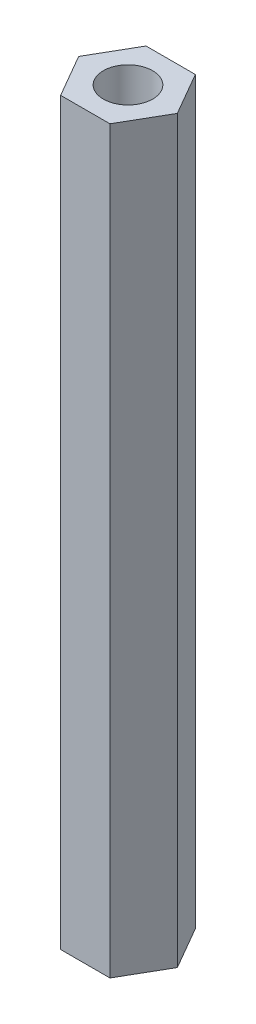
ISO-10303-21;
HEADER;
FILE_DESCRIPTION(('STEP AP214'),'2;1');
FILE_NAME('part.step','',(''),(''),'','','');
FILE_SCHEMA(('AUTOMOTIVE_DESIGN { 1 0 10303 214 1 1 1 1 }'));
ENDSEC;
DATA;
#1=APPLICATION_CONTEXT('core data for automotive mechanical design processes');
#2=APPLICATION_PROTOCOL_DEFINITION('international standard','automotive_design',2000,#1);
#3=PRODUCT_CONTEXT('',#1,'mechanical');
#4=PRODUCT('Part','Part','',(#3));
#5=PRODUCT_RELATED_PRODUCT_CATEGORY('part','',(#4));
#6=PRODUCT_DEFINITION_FORMATION('','',#4);
#7=PRODUCT_DEFINITION_CONTEXT('part definition',#1,'design');
#8=PRODUCT_DEFINITION('design','',#6,#7);
#9=PRODUCT_DEFINITION_SHAPE('','',#8);
#10=(LENGTH_UNIT() NAMED_UNIT(*) SI_UNIT(.MILLI.,.METRE.));
#11=(NAMED_UNIT(*) PLANE_ANGLE_UNIT() SI_UNIT($,.RADIAN.));
#12=(NAMED_UNIT(*) SI_UNIT($,.STERADIAN.) SOLID_ANGLE_UNIT());
#13=UNCERTAINTY_MEASURE_WITH_UNIT(LENGTH_MEASURE(1.E-05),#10,'distance_accuracy_value','');
#14=(GEOMETRIC_REPRESENTATION_CONTEXT(3) GLOBAL_UNCERTAINTY_ASSIGNED_CONTEXT((#13)) GLOBAL_UNIT_ASSIGNED_CONTEXT((#10,
#11,#12)) REPRESENTATION_CONTEXT('',''));
#15=CARTESIAN_POINT('',(0.,0.,0.));
#16=DIRECTION('',(0.,0.,1.));
#17=DIRECTION('',(1.,0.,0.));
#18=AXIS2_PLACEMENT_3D('',#15,#16,#17);
#19=CARTESIAN_POINT('',(0.,60.,2.59863545453777));
#20=DIRECTION('',(0.,0.,1.));
#21=DIRECTION('',(1.,0.,0.));
#22=AXIS2_PLACEMENT_3D('',#19,#20,#21);
#23=PLANE('',#22);
#24=DIRECTION('',(-1.,0.,0.));
#25=VECTOR('',#24,1.);
#26=CARTESIAN_POINT('',(0.,0.,2.59863545453777));
#27=LINE('',#26,#25);
#28=CARTESIAN_POINT('',(2.09823197039388,0.,2.59863545453777));
#29=VERTEX_POINT('',#28);
#30=CARTESIAN_POINT('',(-1.90176802960599,0.,2.59863545453777));
#31=VERTEX_POINT('',#30);
#32=EDGE_CURVE('E122',#29,#31,#27,.T.);
#33=ORIENTED_EDGE('',*,*,#32,.F.);
#34=DIRECTION('',(0.,-1.,0.));
#35=VECTOR('',#34,1.);
#36=CARTESIAN_POINT('',(2.09823197039388,60.,2.59863545453777));
#37=LINE('',#36,#35);
#38=CARTESIAN_POINT('',(2.09823197039388,60.,2.59863545453777));
#39=VERTEX_POINT('',#38);
#40=EDGE_CURVE('E11',#39,#29,#37,.T.);
#41=ORIENTED_EDGE('',*,*,#40,.F.);
#42=DIRECTION('',(-1.,0.,0.));
#43=VECTOR('',#42,1.);
#44=CARTESIAN_POINT('',(0.,60.,2.59863545453777));
#45=LINE('',#44,#43);
#46=CARTESIAN_POINT('',(-1.90176802960599,60.,2.59863545453777));
#47=VERTEX_POINT('',#46);
#48=EDGE_CURVE('E139',#39,#47,#45,.T.);
#49=ORIENTED_EDGE('',*,*,#48,.T.);
#50=DIRECTION('',(0.,-1.,0.));
#51=VECTOR('',#50,1.);
#52=CARTESIAN_POINT('',(-1.90176802960599,60.,2.59863545453777));
#53=LINE('',#52,#51);
#54=EDGE_CURVE('E53',#47,#31,#53,.T.);
#55=ORIENTED_EDGE('',*,*,#54,.T.);
#56=EDGE_LOOP('',(#33,#41,#49,#55));
#57=FACE_BOUND('',#56,.T.);
#58=ADVANCED_FACE('F37',(#57),#23,.T.);
#59=CARTESIAN_POINT('',(2.69891613719772,60.,1.55821995833134));
#60=DIRECTION('',(0.866025403784437,0.,0.500000000000003));
#61=DIRECTION('',(0.500000000000003,0.,-0.866025403784437));
#62=AXIS2_PLACEMENT_3D('',#59,#60,#61);
#63=PLANE('',#62);
#64=DIRECTION('',(-0.500000000000003,0.,0.866025403784437));
#65=VECTOR('',#64,1.);
#66=CARTESIAN_POINT('',(2.69891613719772,0.,1.55821995833134));
#67=LINE('',#66,#65);
#68=CARTESIAN_POINT('',(4.0982319703939,0.,-0.865466160599978));
#69=VERTEX_POINT('',#68);
#70=EDGE_CURVE('E124',#69,#29,#67,.T.);
#71=ORIENTED_EDGE('',*,*,#70,.F.);
#72=DIRECTION('',(0.,-1.,0.));
#73=VECTOR('',#72,1.);
#74=CARTESIAN_POINT('',(4.0982319703939,60.,-0.865466160599978));
#75=LINE('',#74,#73);
#76=CARTESIAN_POINT('',(4.0982319703939,60.,-0.865466160599978));
#77=VERTEX_POINT('',#76);
#78=EDGE_CURVE('E45',#77,#69,#75,.T.);
#79=ORIENTED_EDGE('',*,*,#78,.F.);
#80=DIRECTION('',(-0.500000000000003,0.,0.866025403784437));
#81=VECTOR('',#80,1.);
#82=CARTESIAN_POINT('',(2.69891613719772,60.,1.55821995833134));
#83=LINE('',#82,#81);
#84=EDGE_CURVE('E246',#77,#39,#83,.T.);
#85=ORIENTED_EDGE('',*,*,#84,.T.);
#86=ORIENTED_EDGE('',*,*,#40,.T.);
#87=EDGE_LOOP('',(#71,#79,#85,#86));
#88=FACE_BOUND('',#87,.T.);
#89=ADVANCED_FACE('F148',(#88),#63,.T.);
#90=CARTESIAN_POINT('',(3.44843181839312,60.,-1.99095303863132));
#91=DIRECTION('',(0.866025403784441,0.,-0.499999999999997));
#92=DIRECTION('',(-0.499999999999997,0.,-0.866025403784441));
#93=AXIS2_PLACEMENT_3D('',#90,#91,#92);
#94=PLANE('',#93);
#95=DIRECTION('',(0.499999999999997,0.,0.866025403784441));
#96=VECTOR('',#95,1.);
#97=CARTESIAN_POINT('',(3.44843181839312,0.,-1.99095303863132));
#98=LINE('',#97,#96);
#99=CARTESIAN_POINT('',(2.09823197039391,0.,-4.32956777573774));
#100=VERTEX_POINT('',#99);
#101=EDGE_CURVE('E127',#100,#69,#98,.T.);
#102=ORIENTED_EDGE('',*,*,#101,.F.);
#103=DIRECTION('',(0.,-1.,0.));
#104=VECTOR('',#103,1.);
#105=CARTESIAN_POINT('',(2.09823197039391,60.,-4.32956777573774));
#106=LINE('',#105,#104);
#107=CARTESIAN_POINT('',(2.09823197039391,60.,-4.32956777573774));
#108=VERTEX_POINT('',#107);
#109=EDGE_CURVE('E100',#108,#100,#106,.T.);
#110=ORIENTED_EDGE('',*,*,#109,.F.);
#111=DIRECTION('',(0.499999999999997,0.,0.866025403784441));
#112=VECTOR('',#111,1.);
#113=CARTESIAN_POINT('',(3.44843181839312,60.,-1.99095303863132));
#114=LINE('',#113,#112);
#115=EDGE_CURVE('E111',#108,#77,#114,.T.);
#116=ORIENTED_EDGE('',*,*,#115,.T.);
#117=ORIENTED_EDGE('',*,*,#78,.T.);
#118=EDGE_LOOP('',(#102,#110,#116,#117));
#119=FACE_BOUND('',#118,.T.);
#120=ADVANCED_FACE('F145',(#119),#94,.T.);
#121=CARTESIAN_POINT('',(0.,60.,-4.32956777573774));
#122=DIRECTION('',(0.,0.,-1.));
#123=DIRECTION('',(-1.,0.,0.));
#124=AXIS2_PLACEMENT_3D('',#121,#122,#123);
#125=PLANE('',#124);
#126=DIRECTION('',(1.,0.,0.));
#127=VECTOR('',#126,1.);
#128=CARTESIAN_POINT('',(0.,0.,-4.32956777573774));
#129=LINE('',#128,#127);
#130=CARTESIAN_POINT('',(-1.90176802960609,0.,-4.32956777573774));
#131=VERTEX_POINT('',#130);
#132=EDGE_CURVE('E96',#131,#100,#129,.T.);
#133=ORIENTED_EDGE('',*,*,#132,.F.);
#134=DIRECTION('',(0.,-1.,0.));
#135=VECTOR('',#134,1.);
#136=CARTESIAN_POINT('',(-1.90176802960609,60.,-4.32956777573774));
#137=LINE('',#136,#135);
#138=CARTESIAN_POINT('',(-1.90176802960609,60.,-4.32956777573774));
#139=VERTEX_POINT('',#138);
#140=EDGE_CURVE('E91',#139,#131,#137,.T.);
#141=ORIENTED_EDGE('',*,*,#140,.F.);
#142=DIRECTION('',(1.,0.,0.));
#143=VECTOR('',#142,1.);
#144=CARTESIAN_POINT('',(0.,60.,-4.32956777573774));
#145=LINE('',#144,#143);
#146=EDGE_CURVE('E94',#139,#108,#145,.T.);
#147=ORIENTED_EDGE('',*,*,#146,.T.);
#148=ORIENTED_EDGE('',*,*,#109,.T.);
#149=EDGE_LOOP('',(#133,#141,#147,#148));
#150=FACE_BOUND('',#149,.T.);
#151=ADVANCED_FACE('F93',(#150),#125,.T.);
#152=CARTESIAN_POINT('',(-3.30108386280224,60.,-1.9058816568063));
#153=DIRECTION('',(-0.86602540378445,0.,-0.49999999999998));
#154=DIRECTION('',(-0.49999999999998,0.,0.86602540378445));
#155=AXIS2_PLACEMENT_3D('',#152,#153,#154);
#156=PLANE('',#155);
#157=DIRECTION('',(0.49999999999998,0.,-0.86602540378445));
#158=VECTOR('',#157,1.);
#159=CARTESIAN_POINT('',(-3.30108386280224,0.,-1.9058816568063));
#160=LINE('',#159,#158);
#161=CARTESIAN_POINT('',(-3.90176802960601,0.,-0.865466160599942));
#162=VERTEX_POINT('',#161);
#163=EDGE_CURVE('E131',#162,#131,#160,.T.);
#164=ORIENTED_EDGE('',*,*,#163,.F.);
#165=DIRECTION('',(0.,-1.,0.));
#166=VECTOR('',#165,1.);
#167=CARTESIAN_POINT('',(-3.90176802960601,60.,-0.865466160599942));
#168=LINE('',#167,#166);
#169=CARTESIAN_POINT('',(-3.90176802960601,60.,-0.865466160599942));
#170=VERTEX_POINT('',#169);
#171=EDGE_CURVE('E72',#170,#162,#168,.T.);
#172=ORIENTED_EDGE('',*,*,#171,.F.);
#173=DIRECTION('',(0.49999999999998,0.,-0.86602540378445));
#174=VECTOR('',#173,1.);
#175=CARTESIAN_POINT('',(-3.30108386280224,60.,-1.9058816568063));
#176=LINE('',#175,#174);
#177=EDGE_CURVE('E108',#170,#139,#176,.T.);
#178=ORIENTED_EDGE('',*,*,#177,.T.);
#179=ORIENTED_EDGE('',*,*,#140,.T.);
#180=EDGE_LOOP('',(#164,#172,#178,#179));
#181=FACE_BOUND('',#180,.T.);
#182=ADVANCED_FACE('F113',(#181),#156,.T.);
#183=CARTESIAN_POINT('',(-2.5515681816068,60.,1.47314857650641));
#184=DIRECTION('',(-0.866025403784434,0.,0.500000000000009));
#185=DIRECTION('',(0.500000000000009,0.,0.866025403784434));
#186=AXIS2_PLACEMENT_3D('',#183,#184,#185);
#187=PLANE('',#186);
#188=DIRECTION('',(-0.500000000000009,0.,-0.866025403784434));
#189=VECTOR('',#188,1.);
#190=CARTESIAN_POINT('',(-2.5515681816068,0.,1.47314857650641));
#191=LINE('',#190,#189);
#192=EDGE_CURVE('E133',#31,#162,#191,.T.);
#193=ORIENTED_EDGE('',*,*,#192,.F.);
#194=ORIENTED_EDGE('',*,*,#54,.F.);
#195=DIRECTION('',(-0.500000000000009,0.,-0.866025403784434));
#196=VECTOR('',#195,1.);
#197=CARTESIAN_POINT('',(-2.5515681816068,60.,1.47314857650641));
#198=LINE('',#197,#196);
#199=EDGE_CURVE('E114',#47,#170,#198,.T.);
#200=ORIENTED_EDGE('',*,*,#199,.T.);
#201=ORIENTED_EDGE('',*,*,#171,.T.);
#202=EDGE_LOOP('',(#193,#194,#200,#201));
#203=FACE_BOUND('',#202,.T.);
#204=ADVANCED_FACE('F152',(#203),#187,.T.);
#205=CARTESIAN_POINT('',(0.0982319703939152,60.,-0.86546616059996));
#206=DIRECTION('',(0.,-1.,0.));
#207=DIRECTION('',(0.,0.,-1.));
#208=AXIS2_PLACEMENT_3D('',#205,#206,#207);
#209=CYLINDRICAL_SURFACE('',#208,2.);
#210=CARTESIAN_POINT('',(0.0982319703939152,60.,-0.86546616059996));
#211=DIRECTION('',(0.,1.,0.));
#212=DIRECTION('',(0.,0.,1.));
#213=AXIS2_PLACEMENT_3D('',#210,#211,#212);
#214=CIRCLE('',#213,2.);
#215=CARTESIAN_POINT('',(0.0982319703939152,60.,1.13453383940004));
#216=VERTEX_POINT('',#215);
#217=EDGE_CURVE('E116',#216,#216,#214,.T.);
#218=ORIENTED_EDGE('',*,*,#217,.T.);
#219=EDGE_LOOP('',(#218));
#220=FACE_BOUND('',#219,.T.);
#221=CARTESIAN_POINT('',(0.0982319703939152,0.,-0.86546616059996));
#222=DIRECTION('',(0.,1.,0.));
#223=DIRECTION('',(0.,0.,1.));
#224=AXIS2_PLACEMENT_3D('',#221,#222,#223);
#225=CIRCLE('',#224,2.);
#226=CARTESIAN_POINT('',(0.0982319703939152,0.,1.13453383940004));
#227=VERTEX_POINT('',#226);
#228=EDGE_CURVE('E136',#227,#227,#225,.T.);
#229=ORIENTED_EDGE('',*,*,#228,.F.);
#230=EDGE_LOOP('',(#229));
#231=FACE_BOUND('',#230,.T.);
#232=ADVANCED_FACE('F154',(#220,#231),#209,.F.);
#233=CARTESIAN_POINT('',(0.,60.,0.));
#234=DIRECTION('',(0.,1.,0.));
#235=DIRECTION('',(0.,0.,1.));
#236=AXIS2_PLACEMENT_3D('',#233,#234,#235);
#237=PLANE('',#236);
#238=ORIENTED_EDGE('',*,*,#48,.F.);
#239=ORIENTED_EDGE('',*,*,#84,.F.);
#240=ORIENTED_EDGE('',*,*,#115,.F.);
#241=ORIENTED_EDGE('',*,*,#146,.F.);
#242=ORIENTED_EDGE('',*,*,#177,.F.);
#243=ORIENTED_EDGE('',*,*,#199,.F.);
#244=EDGE_LOOP('',(#238,#239,#240,#241,#242,#243));
#245=FACE_BOUND('',#244,.T.);
#246=ORIENTED_EDGE('',*,*,#217,.F.);
#247=EDGE_LOOP('',(#246));
#248=FACE_BOUND('',#247,.T.);
#249=ADVANCED_FACE('F105',(#245,#248),#237,.T.);
#250=CARTESIAN_POINT('',(0.,0.,0.));
#251=DIRECTION('',(0.,1.,0.));
#252=DIRECTION('',(0.,0.,1.));
#253=AXIS2_PLACEMENT_3D('',#250,#251,#252);
#254=PLANE('',#253);
#255=ORIENTED_EDGE('',*,*,#32,.T.);
#256=ORIENTED_EDGE('',*,*,#192,.T.);
#257=ORIENTED_EDGE('',*,*,#163,.T.);
#258=ORIENTED_EDGE('',*,*,#132,.T.);
#259=ORIENTED_EDGE('',*,*,#101,.T.);
#260=ORIENTED_EDGE('',*,*,#70,.T.);
#261=EDGE_LOOP('',(#255,#256,#257,#258,#259,#260));
#262=FACE_BOUND('',#261,.T.);
#263=ORIENTED_EDGE('',*,*,#228,.T.);
#264=EDGE_LOOP('',(#263));
#265=FACE_BOUND('',#264,.T.);
#266=ADVANCED_FACE('F150',(#262,#265),#254,.F.);
#267=CLOSED_SHELL('',(#58,#89,#120,#151,#182,#204,#232,#249,#266));
#268=MANIFOLD_SOLID_BREP('B2',#267);
#269=ADVANCED_BREP_SHAPE_REPRESENTATION('',(#18,#268),#14);
#270=SHAPE_DEFINITION_REPRESENTATION(#9,#269);
ENDSEC;
END-ISO-10303-21;
